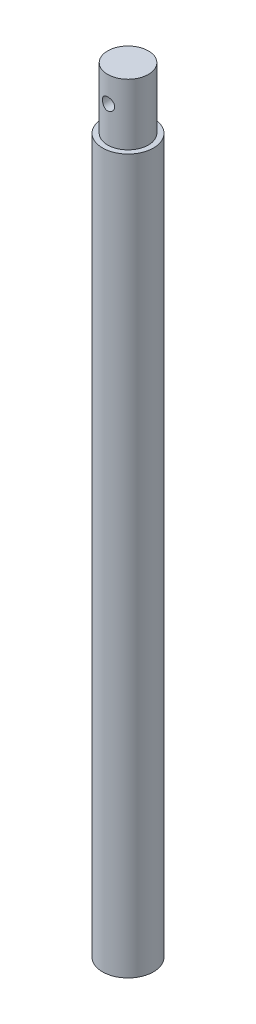
ISO-10303-21;
HEADER;
FILE_DESCRIPTION(('STEP AP214'),'2;1');
FILE_NAME('part.step','',(''),(''),'','','');
FILE_SCHEMA(('AUTOMOTIVE_DESIGN { 1 0 10303 214 1 1 1 1 }'));
ENDSEC;
DATA;
#1=APPLICATION_CONTEXT('core data for automotive mechanical design processes');
#2=APPLICATION_PROTOCOL_DEFINITION('international standard','automotive_design',2000,#1);
#3=PRODUCT_CONTEXT('',#1,'mechanical');
#4=PRODUCT('Part','Part','',(#3));
#5=PRODUCT_RELATED_PRODUCT_CATEGORY('part','',(#4));
#6=PRODUCT_DEFINITION_FORMATION('','',#4);
#7=PRODUCT_DEFINITION_CONTEXT('part definition',#1,'design');
#8=PRODUCT_DEFINITION('design','',#6,#7);
#9=PRODUCT_DEFINITION_SHAPE('','',#8);
#10=(LENGTH_UNIT() NAMED_UNIT(*) SI_UNIT(.MILLI.,.METRE.));
#11=(NAMED_UNIT(*) PLANE_ANGLE_UNIT() SI_UNIT($,.RADIAN.));
#12=(NAMED_UNIT(*) SI_UNIT($,.STERADIAN.) SOLID_ANGLE_UNIT());
#13=UNCERTAINTY_MEASURE_WITH_UNIT(LENGTH_MEASURE(1.E-05),#10,'distance_accuracy_value','');
#14=(GEOMETRIC_REPRESENTATION_CONTEXT(3) GLOBAL_UNCERTAINTY_ASSIGNED_CONTEXT((#13)) GLOBAL_UNIT_ASSIGNED_CONTEXT((#10,
#11,#12)) REPRESENTATION_CONTEXT('',''));
#15=CARTESIAN_POINT('',(0.,0.,0.));
#16=DIRECTION('',(0.,0.,1.));
#17=DIRECTION('',(1.,0.,0.));
#18=AXIS2_PLACEMENT_3D('',#15,#16,#17);
#19=CARTESIAN_POINT('',(0.,0.,0.));
#20=DIRECTION('',(0.,-1.,0.));
#21=DIRECTION('',(0.,0.,-1.));
#22=AXIS2_PLACEMENT_3D('',#19,#20,#21);
#23=PLANE('',#22);
#24=CARTESIAN_POINT('',(0.,0.,0.));
#25=DIRECTION('',(0.,-1.,0.));
#26=DIRECTION('',(0.,0.,-1.));
#27=AXIS2_PLACEMENT_3D('',#24,#25,#26);
#28=CIRCLE('',#27,12.5);
#29=CARTESIAN_POINT('',(0.,0.,-12.5));
#30=VERTEX_POINT('',#29);
#31=EDGE_CURVE('E10',#30,#30,#28,.T.);
#32=ORIENTED_EDGE('',*,*,#31,.T.);
#33=EDGE_LOOP('',(#32));
#34=FACE_BOUND('',#33,.T.);
#35=ADVANCED_FACE('F31',(#34),#23,.T.);
#36=CARTESIAN_POINT('',(0.,0.,0.));
#37=DIRECTION('',(0.,-1.,0.));
#38=DIRECTION('',(0.,0.,-1.));
#39=AXIS2_PLACEMENT_3D('',#36,#37,#38);
#40=CYLINDRICAL_SURFACE('',#39,12.5);
#41=CARTESIAN_POINT('',(0.,350.,0.));
#42=DIRECTION('',(0.,-1.,0.));
#43=DIRECTION('',(0.,0.,-1.));
#44=AXIS2_PLACEMENT_3D('',#41,#42,#43);
#45=CIRCLE('',#44,12.5);
#46=CARTESIAN_POINT('',(0.,350.,-12.5));
#47=VERTEX_POINT('',#46);
#48=EDGE_CURVE('E43',#47,#47,#45,.T.);
#49=ORIENTED_EDGE('',*,*,#48,.T.);
#50=EDGE_LOOP('',(#49));
#51=FACE_BOUND('',#50,.T.);
#52=ORIENTED_EDGE('',*,*,#31,.F.);
#53=EDGE_LOOP('',(#52));
#54=FACE_BOUND('',#53,.T.);
#55=ADVANCED_FACE('F75',(#51,#54),#40,.T.);
#56=CARTESIAN_POINT('',(12.5,350.,0.));
#57=DIRECTION('',(0.,1.,0.));
#58=DIRECTION('',(0.,0.,1.));
#59=AXIS2_PLACEMENT_3D('',#56,#57,#58);
#60=PLANE('',#59);
#61=CARTESIAN_POINT('',(0.,350.,0.));
#62=DIRECTION('',(0.,-1.,0.));
#63=DIRECTION('',(0.,0.,-1.));
#64=AXIS2_PLACEMENT_3D('',#61,#62,#63);
#65=CIRCLE('',#64,10.);
#66=CARTESIAN_POINT('',(0.,350.,-10.));
#67=VERTEX_POINT('',#66);
#68=EDGE_CURVE('E48',#67,#67,#65,.T.);
#69=ORIENTED_EDGE('',*,*,#68,.T.);
#70=EDGE_LOOP('',(#69));
#71=FACE_BOUND('',#70,.T.);
#72=ORIENTED_EDGE('',*,*,#48,.F.);
#73=EDGE_LOOP('',(#72));
#74=FACE_BOUND('',#73,.T.);
#75=ADVANCED_FACE('F71',(#71,#74),#60,.T.);
#76=CARTESIAN_POINT('',(0.,0.,0.));
#77=DIRECTION('',(0.,-1.,0.));
#78=DIRECTION('',(0.,0.,-1.));
#79=AXIS2_PLACEMENT_3D('',#76,#77,#78);
#80=CYLINDRICAL_SURFACE('',#79,10.);
#81=CARTESIAN_POINT('',(0.,370.5,-10.));
#82=CARTESIAN_POINT('',(0.164577225506596,370.49999800503,-9.999998585011));
#83=CARTESIAN_POINT('',(0.329174636703054,370.486412272752,-9.99589831387907));
#84=CARTESIAN_POINT('',(0.653576250609755,370.432557291556,-9.97994211187382));
#85=CARTESIAN_POINT('',(0.813379008822833,370.392280083953,-9.96808386779384));
#86=CARTESIAN_POINT('',(1.12346541550904,370.286507966179,-9.93791105003673));
#87=CARTESIAN_POINT('',(1.27376272879073,370.221050260762,-9.91960600500851));
#88=CARTESIAN_POINT('',(1.56124836210626,370.066927813888,-9.8784421847529));
#89=CARTESIAN_POINT('',(1.69843493493934,369.978259985209,-9.85558280384133));
#90=CARTESIAN_POINT('',(1.95974359436748,369.777551985055,-9.80701474385548));
#91=CARTESIAN_POINT('',(2.08343614248865,369.664966748228,-9.78124767314073));
#92=CARTESIAN_POINT('',(2.31049841846644,369.42078154018,-9.73011668420885));
#93=CARTESIAN_POINT('',(2.4138647265488,369.28917837575,-9.70475283449003));
#94=CARTESIAN_POINT('',(2.59960075447415,369.007058493925,-9.65668227987544));
#95=CARTESIAN_POINT('',(2.68144618044427,368.856183078019,-9.63404813327749));
#96=CARTESIAN_POINT('',(2.81842789549521,368.542021491539,-9.59487240788062));
#97=CARTESIAN_POINT('',(2.87357059839946,368.378738312144,-9.57832936626621));
#98=CARTESIAN_POINT('',(2.95403267365303,368.049219467739,-9.55381741676868));
#99=CARTESIAN_POINT('',(2.98014392469354,367.883194512272,-9.54562138649067));
#100=CARTESIAN_POINT('',(3.00427461229344,367.548933687567,-9.53805579499534));
#101=CARTESIAN_POINT('',(3.00230085522157,367.380698363882,-9.53868409521142));
#102=CARTESIAN_POINT('',(2.97093954399624,367.053232182783,-9.54849488135555));
#103=CARTESIAN_POINT('',(2.94254410525371,366.893895499276,-9.55736777198281));
#104=CARTESIAN_POINT('',(2.86074840854114,366.582360427453,-9.58216712457248));
#105=CARTESIAN_POINT('',(2.80734568283284,366.430162745251,-9.598094282647));
#106=CARTESIAN_POINT('',(2.67632053307366,366.134799300679,-9.63545466149945));
#107=CARTESIAN_POINT('',(2.59837633869288,365.99178583209,-9.65696032231903));
#108=CARTESIAN_POINT('',(2.4207044517737,365.72053595598,-9.70301974000128));
#109=CARTESIAN_POINT('',(2.32097148005179,365.592303141172,-9.72757423493981));
#110=CARTESIAN_POINT('',(2.09762581531095,365.348627618476,-9.77822022595874));
#111=CARTESIAN_POINT('',(1.97318981493396,365.233942671941,-9.80433308620995));
#112=CARTESIAN_POINT('',(1.70652651862794,365.026892031872,-9.85424488126517));
#113=CARTESIAN_POINT('',(1.56429810372178,364.934527743171,-9.8780436703682));
#114=CARTESIAN_POINT('',(1.26471007668562,364.774280155071,-9.9208632013894));
#115=CARTESIAN_POINT('',(1.10725549949592,364.7065649675,-9.93985087336628));
#116=CARTESIAN_POINT('',(0.78249083120706,364.598800819801,-9.97067043664444));
#117=CARTESIAN_POINT('',(0.615183503179175,364.558744142935,-9.98250432373998));
#118=CARTESIAN_POINT('',(0.281904485336668,364.508695644201,-9.99736729287076));
#119=CARTESIAN_POINT('',(0.116100195202381,364.497676828397,-10.0006970083558));
#120=CARTESIAN_POINT('',(-0.214999211646756,364.503138311424,-9.99905846483519));
#121=CARTESIAN_POINT('',(-0.380294393381551,364.519614939303,-9.99409131355514));
#122=CARTESIAN_POINT('',(-0.701807210619389,364.578769222223,-9.97661393974325));
#123=CARTESIAN_POINT('',(-0.85814554522834,364.620846775162,-9.96427659598828));
#124=CARTESIAN_POINT('',(-1.16150927790905,364.729286465556,-9.9334869568307));
#125=CARTESIAN_POINT('',(-1.30853355405116,364.795651522076,-9.91503392642188));
#126=CARTESIAN_POINT('',(-1.59287437892211,364.952506330962,-9.87339308702631));
#127=CARTESIAN_POINT('',(-1.72988765239935,365.043518681896,-9.8501056165928));
#128=CARTESIAN_POINT('',(-1.98704661596031,365.246449508106,-9.80146937528704));
#129=CARTESIAN_POINT('',(-2.10718806471189,365.358373223775,-9.77612008862419));
#130=CARTESIAN_POINT('',(-2.33171489102052,365.604774616739,-9.72506343738007));
#131=CARTESIAN_POINT('',(-2.43536962463002,365.739923751544,-9.69937650065513));
#132=CARTESIAN_POINT('',(-2.61857990144314,366.026255878027,-9.65153030477949));
#133=CARTESIAN_POINT('',(-2.69813607658965,366.177438449116,-9.62937095313121));
#134=CARTESIAN_POINT('',(-2.83034694254315,366.49106498251,-9.5913437922631));
#135=CARTESIAN_POINT('',(-2.88312693874022,366.653452373076,-9.575446756735));
#136=CARTESIAN_POINT('',(-2.96043461630307,366.98537593786,-9.55183188739737));
#137=CARTESIAN_POINT('',(-2.98497197957849,367.154909641566,-9.54411125069387));
#138=CARTESIAN_POINT('',(-3.0044396896993,367.488723036777,-9.53799944941558));
#139=CARTESIAN_POINT('',(-3.00056110615887,367.652927302099,-9.53923294700394));
#140=CARTESIAN_POINT('',(-2.96615010888611,367.978228206801,-9.54998802392188));
#141=CARTESIAN_POINT('',(-2.93561876249408,368.139324970361,-9.55950927135902));
#142=CARTESIAN_POINT('',(-2.84953777608685,368.451890798263,-9.58551527389243));
#143=CARTESIAN_POINT('',(-2.79430351014246,368.603454574717,-9.60191209104934));
#144=CARTESIAN_POINT('',(-2.66063014242145,368.895284877641,-9.63980557805266));
#145=CARTESIAN_POINT('',(-2.5821865992572,369.035549235283,-9.6613032238508));
#146=CARTESIAN_POINT('',(-2.40097527610174,369.306326233053,-9.70795352855338));
#147=CARTESIAN_POINT('',(-2.29742552185994,369.43629752252,-9.73321080328581));
#148=CARTESIAN_POINT('',(-2.07034869259554,369.677404996616,-9.78402640899067));
#149=CARTESIAN_POINT('',(-1.94681643426897,369.788536278936,-9.80958481647543));
#150=CARTESIAN_POINT('',(-1.67893152436652,369.99204682459,-9.85901873141573));
#151=CARTESIAN_POINT('',(-1.53407577158123,370.083782893711,-9.88282319531421));
#152=CARTESIAN_POINT('',(-1.23028274796706,370.241470339808,-9.92521360911552));
#153=CARTESIAN_POINT('',(-1.07135210599791,370.307433776549,-9.94380199862114));
#154=CARTESIAN_POINT('',(-0.761515425310564,370.405790551306,-9.97204349938618));
#155=CARTESIAN_POINT('',(-0.611573923908468,370.441023345766,-9.98244054762139));
#156=CARTESIAN_POINT('',(-0.307760390461558,370.488127050483,-9.9964188898898));
#157=CARTESIAN_POINT('',(-0.153889019716279,370.50000186541,-10.0000013230948));
#158=CARTESIAN_POINT('',(0.,370.5,-10.));
#159=B_SPLINE_CURVE_WITH_KNOTS('',3,(#81,#82,#83,#84,#85,#86,#87,#88,#89,#90,#91,#92,#93,#94,
#95,#96,#97,#98,#99,#100,#101,#102,#103,#104,#105,#106,#107,#108,#109,#110,#111,#112,#113,#114,
#115,#116,#117,#118,#119,#120,#121,#122,#123,#124,#125,#126,#127,#128,#129,#130,#131,#132,#133,
#134,#135,#136,#137,#138,#139,#140,#141,#142,#143,#144,#145,#146,#147,#148,#149,#150,#151,#152,
#153,#154,#155,#156,#157,#158),.UNSPECIFIED.,.T.,.F.,(4,2,2,2,2,2,2,2,2,2,2,2,2,2,2,2,2,2,2,2,2,
2,2,2,2,2,2,2,2,2,2,2,2,2,2,2,2,2,4),(0.,0.493166407225214,0.986479929691996,1.47906735260174,
1.97172032882538,2.47711205896378,2.98258874577263,3.49942962008215,4.01614629086449,
4.51839378713193,5.02051956638177,5.50452033395344,5.98856887315995,6.47924852894232,
6.97004720317106,7.48134208096331,7.99266913062141,8.50742093763375,9.02202907057615,
9.51817618877089,10.0142570710065,10.4991349336465,10.9840710918746,11.4802261140582,
11.9765056400038,12.4908080064564,13.0050968850536,13.516956299025,14.0286401892057,
14.5190031093854,15.0093463933232,15.4936008081456,15.9779479511534,16.4799385136898,
16.9820594980412,17.4988599232246,18.0154182319959,18.4766338387004,18.9377723390687),.UNSPECIFIED.);
#160=CARTESIAN_POINT('',(0.,370.5,-10.));
#161=VERTEX_POINT('',#160);
#162=EDGE_CURVE('E34',#161,#161,#159,.T.);
#163=ORIENTED_EDGE('',*,*,#162,.F.);
#164=EDGE_LOOP('',(#163));
#165=FACE_BOUND('',#164,.T.);
#166=CARTESIAN_POINT('',(3.,367.5,9.53939201416945));
#167=CARTESIAN_POINT('',(2.99999795267528,367.664389095885,9.5393937145396));
#168=CARTESIAN_POINT('',(2.98644216334285,367.828798448288,9.54368780418137));
#169=CARTESIAN_POINT('',(2.93271688893498,368.152810499184,9.56033156605799));
#170=CARTESIAN_POINT('',(2.89253851147156,368.312411573003,9.57268392986936));
#171=CARTESIAN_POINT('',(2.78705506539912,368.622069456543,9.60392204971265));
#172=CARTESIAN_POINT('',(2.72179178788489,368.772141659266,9.62279693406464));
#173=CARTESIAN_POINT('',(2.56812843835859,369.059243867991,9.66493865095134));
#174=CARTESIAN_POINT('',(2.47972490274105,369.196271917369,9.68820614082039));
#175=CARTESIAN_POINT('',(2.27929508283253,369.457732781155,9.73733724371531));
#176=CARTESIAN_POINT('',(2.16666414351614,369.581691795893,9.76325616623271));
#177=CARTESIAN_POINT('',(1.92227247515922,369.809275902645,9.81429723873513));
#178=CARTESIAN_POINT('',(1.79050929092225,369.9128983809,9.83941928595409));
#179=CARTESIAN_POINT('',(1.50822287558741,370.098925399667,9.88666429158777));
#180=CARTESIAN_POINT('',(1.35736804267164,370.180846848886,9.90871448684808));
#181=CARTESIAN_POINT('',(1.0432492907387,370.317974518086,9.94668871841369));
#182=CARTESIAN_POINT('',(0.879988056775817,370.373186499715,9.96261407578992));
#183=CARTESIAN_POINT('',(0.550647705261652,370.453760002181,9.98615292007178));
#184=CARTESIAN_POINT('',(0.384782797907597,370.479930255305,9.99399114738673));
#185=CARTESIAN_POINT('',(0.0508436474986263,370.504234649293,10.001264030027));
#186=CARTESIAN_POINT('',(-0.117230124100741,370.502374678804,10.0007004504217));
#187=CARTESIAN_POINT('',(-0.445142313200315,370.471214262914,9.99139207635305));
#188=CARTESIAN_POINT('',(-0.605072535282668,370.44278961238,9.98290840410475));
#189=CARTESIAN_POINT('',(-0.917778426885076,370.360737328011,9.95903044225231));
#190=CARTESIAN_POINT('',(-1.07055364264576,370.307108098114,9.94363571501341));
#191=CARTESIAN_POINT('',(-1.36669465270247,370.175575953163,9.90730441973756));
#192=CARTESIAN_POINT('',(-1.50993012938865,370.097397594386,9.88630539352772));
#193=CARTESIAN_POINT('',(-1.78152934756665,369.919204295143,9.84099281296777));
#194=CARTESIAN_POINT('',(-1.90988954974545,369.819184174071,9.81667847277943));
#195=CARTESIAN_POINT('',(-2.15332096305837,369.595604498499,9.76623100973852));
#196=CARTESIAN_POINT('',(-2.26768916079756,369.471286161949,9.74006390633502));
#197=CARTESIAN_POINT('',(-2.47415303080115,369.204979964211,9.68967959784414));
#198=CARTESIAN_POINT('',(-2.56624648967453,369.062990349189,9.66546258669242));
#199=CARTESIAN_POINT('',(-2.72627990669512,368.763521061528,9.62155806359712));
#200=CARTESIAN_POINT('',(-2.79397978469378,368.605905908383,9.6019162125849));
#201=CARTESIAN_POINT('',(-2.90166725750739,368.280785583221,9.5699278496379));
#202=CARTESIAN_POINT('',(-2.94166389279494,368.113283656965,9.55757895796639));
#203=CARTESIAN_POINT('',(-2.99149540565762,367.779835278498,9.54209699116239));
#204=CARTESIAN_POINT('',(-3.00239892760807,367.614063552206,9.53863757349917));
#205=CARTESIAN_POINT('',(-2.99671894465741,367.283054199987,9.54042384874812));
#206=CARTESIAN_POINT('',(-2.98013928742559,367.11781650254,9.54566832310786));
#207=CARTESIAN_POINT('',(-2.9209152714848,366.797023244057,9.56395117112153));
#208=CARTESIAN_POINT('',(-2.87895922862589,366.641327671473,9.57678353015601));
#209=CARTESIAN_POINT('',(-2.77097155495855,366.339196618371,9.60858282461829));
#210=CARTESIAN_POINT('',(-2.70493620685512,366.192762571719,9.62755070717977));
#211=CARTESIAN_POINT('',(-2.54863742393009,365.908965071856,9.67011670046268));
#212=CARTESIAN_POINT('',(-2.45777128345462,365.771950558028,9.69382542139643));
#213=CARTESIAN_POINT('',(-2.25510603200769,365.514723787638,9.74296411293927));
#214=CARTESIAN_POINT('',(-2.14330191069793,365.394515564774,9.76839449459993));
#215=CARTESIAN_POINT('',(-1.89691026498721,365.169639188371,9.81927267096329));
#216=CARTESIAN_POINT('',(-1.76162213171489,365.065728742026,9.84468490126011));
#217=CARTESIAN_POINT('',(-1.47492356918053,364.882066597945,9.89169703497297));
#218=CARTESIAN_POINT('',(-1.32351394108791,364.802313700437,9.91329712769432));
#219=CARTESIAN_POINT('',(-1.00987100941047,364.669999938863,9.95011940949915));
#220=CARTESIAN_POINT('',(-0.847729244075702,364.617235967682,9.96538906849931));
#221=CARTESIAN_POINT('',(-0.516339933009201,364.539878162219,9.98803959193653));
#222=CARTESIAN_POINT('',(-0.34709443470955,364.515276268103,9.9954227134176));
#223=CARTESIAN_POINT('',(-0.0133043077655076,364.495553911891,10.001330881628));
#224=CARTESIAN_POINT('',(0.151170358172393,364.499334609184,10.0001861022264));
#225=CARTESIAN_POINT('',(0.477038962328792,364.533643264998,9.98994528930073));
#226=CARTESIAN_POINT('',(0.638433074693043,364.564169706961,9.98084970660925));
#227=CARTESIAN_POINT('',(0.951871626082695,364.650423322799,9.95582336716653));
#228=CARTESIAN_POINT('',(1.10399785470275,364.705876361298,9.93996705801732));
#229=CARTESIAN_POINT('',(1.39686647550408,364.840163829014,9.903058860789));
#230=CARTESIAN_POINT('',(1.53760699210114,364.919002100572,9.88200611899892));
#231=CARTESIAN_POINT('',(1.80860378484111,365.10074691486,9.83607931656457));
#232=CARTESIAN_POINT('',(1.93838050015351,365.204342860002,9.81110453847119));
#233=CARTESIAN_POINT('',(2.17907514269187,365.431420776666,9.76047074424668));
#234=CARTESIAN_POINT('',(2.28998761920385,365.554908475796,9.73481153282158));
#235=CARTESIAN_POINT('',(2.49312538789096,365.822681556621,9.68481361262638));
#236=CARTESIAN_POINT('',(2.58469519515912,365.967477106781,9.66053705386971));
#237=CARTESIAN_POINT('',(2.7420862705755,366.271110348322,9.61705095017586));
#238=CARTESIAN_POINT('',(2.80791991114576,366.429941247202,9.59783897193911));
#239=CARTESIAN_POINT('',(2.90603885065898,366.739480863213,9.56855633435189));
#240=CARTESIAN_POINT('',(2.94117718022463,366.889217293862,9.5577230968104));
#241=CARTESIAN_POINT('',(2.98815637670288,367.192630444992,9.54314085194333));
#242=CARTESIAN_POINT('',(3.00000191412191,367.346306369291,9.53939042442861));
#243=CARTESIAN_POINT('',(3.,367.5,9.53939201416945));
#244=B_SPLINE_CURVE_WITH_KNOTS('',3,(#166,#167,#168,#169,#170,#171,#172,#173,#174,#175,#176,
#177,#178,#179,#180,#181,#182,#183,#184,#185,#186,#187,#188,#189,#190,#191,#192,#193,#194,#195,
#196,#197,#198,#199,#200,#201,#202,#203,#204,#205,#206,#207,#208,#209,#210,#211,#212,#213,#214,
#215,#216,#217,#218,#219,#220,#221,#222,#223,#224,#225,#226,#227,#228,#229,#230,#231,#232,#233,
#234,#235,#236,#237,#238,#239,#240,#241,#242,#243),.UNSPECIFIED.,.T.,.F.,(4,2,2,2,2,2,2,2,2,2,2,
2,2,2,2,2,2,2,2,2,2,2,2,2,2,2,2,2,2,2,2,2,2,2,2,2,2,2,4),(0.,0.492600331831125,
0.985365283377987,1.47731282893238,1.96933405074021,2.47546300015968,2.98165695742543,
3.49831878547289,4.01486911175756,4.51664280299117,5.01831108202881,5.50400251981762,
5.98972471780752,6.48110418671355,6.97260033181663,7.48304294046559,7.99353624983725,
8.50892476494932,9.02414501262031,9.52016161585833,10.0161087821998,10.4991718988284,
10.9823096209678,11.4784146362399,11.9746385186306,12.4895901220641,13.0045161465361,
13.5155078363386,14.0263532464857,14.5175260782765,15.0086710610072,15.4945419374965,
15.9804926898797,16.4819925411419,16.9836370526499,17.500232793435,18.016579879331,
18.4772230772011,18.9377739007233),.UNSPECIFIED.);
#245=CARTESIAN_POINT('',(3.,367.5,9.53939201416945));
#246=VERTEX_POINT('',#245);
#247=EDGE_CURVE('E51',#246,#246,#244,.T.);
#248=ORIENTED_EDGE('',*,*,#247,.F.);
#249=EDGE_LOOP('',(#248));
#250=FACE_BOUND('',#249,.T.);
#251=CARTESIAN_POINT('',(0.,380.,0.));
#252=DIRECTION('',(0.,-1.,0.));
#253=DIRECTION('',(0.,0.,-1.));
#254=AXIS2_PLACEMENT_3D('',#251,#252,#253);
#255=CIRCLE('',#254,10.);
#256=CARTESIAN_POINT('',(0.,380.,-10.));
#257=VERTEX_POINT('',#256);
#258=EDGE_CURVE('E92',#257,#257,#255,.T.);
#259=ORIENTED_EDGE('',*,*,#258,.T.);
#260=EDGE_LOOP('',(#259));
#261=FACE_BOUND('',#260,.T.);
#262=ORIENTED_EDGE('',*,*,#68,.F.);
#263=EDGE_LOOP('',(#262));
#264=FACE_BOUND('',#263,.T.);
#265=ADVANCED_FACE('F56',(#165,#250,#261,#264),#80,.T.);
#266=CARTESIAN_POINT('',(10.,380.,0.));
#267=DIRECTION('',(0.,1.,0.));
#268=DIRECTION('',(0.,0.,1.));
#269=AXIS2_PLACEMENT_3D('',#266,#267,#268);
#270=PLANE('',#269);
#271=ORIENTED_EDGE('',*,*,#258,.F.);
#272=EDGE_LOOP('',(#271));
#273=FACE_BOUND('',#272,.T.);
#274=ADVANCED_FACE('F63',(#273),#270,.T.);
#275=CARTESIAN_POINT('',(0.,367.5,-25.));
#276=DIRECTION('',(0.,0.,1.));
#277=DIRECTION('',(1.,0.,0.));
#278=AXIS2_PLACEMENT_3D('',#275,#276,#277);
#279=CYLINDRICAL_SURFACE('',#278,3.);
#280=ORIENTED_EDGE('',*,*,#162,.T.);
#281=EDGE_LOOP('',(#280));
#282=FACE_BOUND('',#281,.T.);
#283=ORIENTED_EDGE('',*,*,#247,.T.);
#284=EDGE_LOOP('',(#283));
#285=FACE_BOUND('',#284,.T.);
#286=ADVANCED_FACE('F60',(#282,#285),#279,.F.);
#287=CLOSED_SHELL('',(#35,#55,#75,#265,#274,#286));
#288=MANIFOLD_SOLID_BREP('B2',#287);
#289=ADVANCED_BREP_SHAPE_REPRESENTATION('',(#18,#288),#14);
#290=SHAPE_DEFINITION_REPRESENTATION(#9,#289);
ENDSEC;
END-ISO-10303-21;
